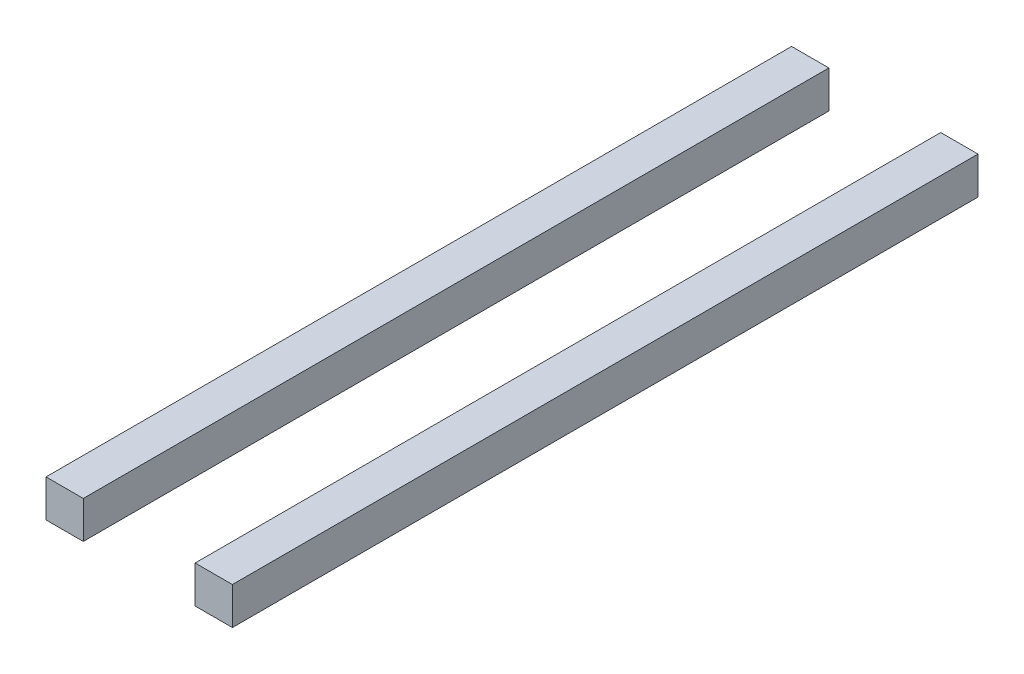
ISO-10303-21;
HEADER;
FILE_DESCRIPTION(('STEP AP214'),'2;1');
FILE_NAME('part.step','',(''),(''),'','','');
FILE_SCHEMA(('AUTOMOTIVE_DESIGN { 1 0 10303 214 1 1 1 1 }'));
ENDSEC;
DATA;
#1=APPLICATION_CONTEXT('core data for automotive mechanical design processes');
#2=APPLICATION_PROTOCOL_DEFINITION('international standard','automotive_design',2000,#1);
#3=PRODUCT_CONTEXT('',#1,'mechanical');
#4=PRODUCT('Part','Part','',(#3));
#5=PRODUCT_RELATED_PRODUCT_CATEGORY('part','',(#4));
#6=PRODUCT_DEFINITION_FORMATION('','',#4);
#7=PRODUCT_DEFINITION_CONTEXT('part definition',#1,'design');
#8=PRODUCT_DEFINITION('design','',#6,#7);
#9=PRODUCT_DEFINITION_SHAPE('','',#8);
#10=(LENGTH_UNIT() NAMED_UNIT(*) SI_UNIT(.MILLI.,.METRE.));
#11=(NAMED_UNIT(*) PLANE_ANGLE_UNIT() SI_UNIT($,.RADIAN.));
#12=(NAMED_UNIT(*) SI_UNIT($,.STERADIAN.) SOLID_ANGLE_UNIT());
#13=UNCERTAINTY_MEASURE_WITH_UNIT(LENGTH_MEASURE(1.E-05),#10,'distance_accuracy_value','');
#14=(GEOMETRIC_REPRESENTATION_CONTEXT(3) GLOBAL_UNCERTAINTY_ASSIGNED_CONTEXT((#13)) GLOBAL_UNIT_ASSIGNED_CONTEXT((#10,
#11,#12)) REPRESENTATION_CONTEXT('',''));
#15=CARTESIAN_POINT('',(0.,0.,0.));
#16=DIRECTION('',(0.,0.,1.));
#17=DIRECTION('',(1.,0.,0.));
#18=AXIS2_PLACEMENT_3D('',#15,#16,#17);
#19=CARTESIAN_POINT('',(-50.,-20.,-400.));
#20=DIRECTION('',(-1.,0.,0.));
#21=DIRECTION('',(0.,0.,1.));
#22=AXIS2_PLACEMENT_3D('',#19,#20,#21);
#23=PLANE('',#22);
#24=DIRECTION('',(0.,-1.,0.));
#25=VECTOR('',#24,1.);
#26=CARTESIAN_POINT('',(-50.,-20.,0.));
#27=LINE('',#26,#25);
#28=CARTESIAN_POINT('',(-50.,0.,0.));
#29=VERTEX_POINT('',#28);
#30=CARTESIAN_POINT('',(-50.,-20.,0.));
#31=VERTEX_POINT('',#30);
#32=EDGE_CURVE('E12',#29,#31,#27,.T.);
#33=ORIENTED_EDGE('',*,*,#32,.F.);
#34=DIRECTION('',(0.,0.,1.));
#35=VECTOR('',#34,1.);
#36=CARTESIAN_POINT('',(-50.,0.,-400.));
#37=LINE('',#36,#35);
#38=CARTESIAN_POINT('',(-50.,0.,-400.));
#39=VERTEX_POINT('',#38);
#40=EDGE_CURVE('E101',#39,#29,#37,.T.);
#41=ORIENTED_EDGE('',*,*,#40,.F.);
#42=DIRECTION('',(0.,-1.,0.));
#43=VECTOR('',#42,1.);
#44=CARTESIAN_POINT('',(-50.,-20.,-400.));
#45=LINE('',#44,#43);
#46=CARTESIAN_POINT('',(-50.,-20.,-400.));
#47=VERTEX_POINT('',#46);
#48=EDGE_CURVE('E57',#39,#47,#45,.T.);
#49=ORIENTED_EDGE('',*,*,#48,.T.);
#50=DIRECTION('',(0.,0.,1.));
#51=VECTOR('',#50,1.);
#52=CARTESIAN_POINT('',(-50.,-20.,-400.));
#53=LINE('',#52,#51);
#54=EDGE_CURVE('E73',#47,#31,#53,.T.);
#55=ORIENTED_EDGE('',*,*,#54,.T.);
#56=EDGE_LOOP('',(#33,#41,#49,#55));
#57=FACE_BOUND('',#56,.T.);
#58=ADVANCED_FACE('F53',(#57),#23,.T.);
#59=CARTESIAN_POINT('',(-50.,0.,-400.));
#60=DIRECTION('',(0.,1.,0.));
#61=DIRECTION('',(0.,0.,1.));
#62=AXIS2_PLACEMENT_3D('',#59,#60,#61);
#63=PLANE('',#62);
#64=DIRECTION('',(-1.,0.,0.));
#65=VECTOR('',#64,1.);
#66=CARTESIAN_POINT('',(-50.,0.,0.));
#67=LINE('',#66,#65);
#68=CARTESIAN_POINT('',(-30.,0.,0.));
#69=VERTEX_POINT('',#68);
#70=EDGE_CURVE('E115',#69,#29,#67,.T.);
#71=ORIENTED_EDGE('',*,*,#70,.F.);
#72=DIRECTION('',(0.,0.,1.));
#73=VECTOR('',#72,1.);
#74=CARTESIAN_POINT('',(-30.,0.,-400.));
#75=LINE('',#74,#73);
#76=CARTESIAN_POINT('',(-30.,0.,-400.));
#77=VERTEX_POINT('',#76);
#78=EDGE_CURVE('E103',#77,#69,#75,.T.);
#79=ORIENTED_EDGE('',*,*,#78,.F.);
#80=DIRECTION('',(-1.,0.,0.));
#81=VECTOR('',#80,1.);
#82=CARTESIAN_POINT('',(-50.,0.,-400.));
#83=LINE('',#82,#81);
#84=EDGE_CURVE('E127',#77,#39,#83,.T.);
#85=ORIENTED_EDGE('',*,*,#84,.T.);
#86=ORIENTED_EDGE('',*,*,#40,.T.);
#87=EDGE_LOOP('',(#71,#79,#85,#86));
#88=FACE_BOUND('',#87,.T.);
#89=ADVANCED_FACE('F118',(#88),#63,.T.);
#90=CARTESIAN_POINT('',(-30.,-20.,-400.));
#91=DIRECTION('',(1.,0.,0.));
#92=DIRECTION('',(0.,0.,-1.));
#93=AXIS2_PLACEMENT_3D('',#90,#91,#92);
#94=PLANE('',#93);
#95=DIRECTION('',(0.,1.,0.));
#96=VECTOR('',#95,1.);
#97=CARTESIAN_POINT('',(-30.,-20.,0.));
#98=LINE('',#97,#96);
#99=CARTESIAN_POINT('',(-30.,-20.,0.));
#100=VERTEX_POINT('',#99);
#101=EDGE_CURVE('E106',#100,#69,#98,.T.);
#102=ORIENTED_EDGE('',*,*,#101,.F.);
#103=DIRECTION('',(0.,0.,1.));
#104=VECTOR('',#103,1.);
#105=CARTESIAN_POINT('',(-30.,-20.,-400.));
#106=LINE('',#105,#104);
#107=CARTESIAN_POINT('',(-30.,-20.,-400.));
#108=VERTEX_POINT('',#107);
#109=EDGE_CURVE('E90',#108,#100,#106,.T.);
#110=ORIENTED_EDGE('',*,*,#109,.F.);
#111=DIRECTION('',(0.,1.,0.));
#112=VECTOR('',#111,1.);
#113=CARTESIAN_POINT('',(-30.,-20.,-400.));
#114=LINE('',#113,#112);
#115=EDGE_CURVE('E108',#108,#77,#114,.T.);
#116=ORIENTED_EDGE('',*,*,#115,.T.);
#117=ORIENTED_EDGE('',*,*,#78,.T.);
#118=EDGE_LOOP('',(#102,#110,#116,#117));
#119=FACE_BOUND('',#118,.T.);
#120=ADVANCED_FACE('F105',(#119),#94,.T.);
#121=CARTESIAN_POINT('',(-50.,-20.,-400.));
#122=DIRECTION('',(0.,-1.,0.));
#123=DIRECTION('',(0.,0.,-1.));
#124=AXIS2_PLACEMENT_3D('',#121,#122,#123);
#125=PLANE('',#124);
#126=DIRECTION('',(1.,0.,0.));
#127=VECTOR('',#126,1.);
#128=CARTESIAN_POINT('',(-50.,-20.,0.));
#129=LINE('',#128,#127);
#130=EDGE_CURVE('E64',#31,#100,#129,.T.);
#131=ORIENTED_EDGE('',*,*,#130,.F.);
#132=ORIENTED_EDGE('',*,*,#54,.F.);
#133=DIRECTION('',(1.,0.,0.));
#134=VECTOR('',#133,1.);
#135=CARTESIAN_POINT('',(-50.,-20.,-400.));
#136=LINE('',#135,#134);
#137=EDGE_CURVE('E122',#47,#108,#136,.T.);
#138=ORIENTED_EDGE('',*,*,#137,.T.);
#139=ORIENTED_EDGE('',*,*,#109,.T.);
#140=EDGE_LOOP('',(#131,#132,#138,#139));
#141=FACE_BOUND('',#140,.T.);
#142=ADVANCED_FACE('F132',(#141),#125,.T.);
#143=CARTESIAN_POINT('',(0.,0.,-400.));
#144=DIRECTION('',(0.,0.,-1.));
#145=DIRECTION('',(-1.,0.,0.));
#146=AXIS2_PLACEMENT_3D('',#143,#144,#145);
#147=PLANE('',#146);
#148=ORIENTED_EDGE('',*,*,#48,.F.);
#149=ORIENTED_EDGE('',*,*,#84,.F.);
#150=ORIENTED_EDGE('',*,*,#115,.F.);
#151=ORIENTED_EDGE('',*,*,#137,.F.);
#152=EDGE_LOOP('',(#148,#149,#150,#151));
#153=FACE_BOUND('',#152,.T.);
#154=ADVANCED_FACE('F55',(#153),#147,.T.);
#155=CARTESIAN_POINT('',(0.,0.,0.));
#156=DIRECTION('',(0.,0.,-1.));
#157=DIRECTION('',(-1.,0.,0.));
#158=AXIS2_PLACEMENT_3D('',#155,#156,#157);
#159=PLANE('',#158);
#160=ORIENTED_EDGE('',*,*,#32,.T.);
#161=ORIENTED_EDGE('',*,*,#130,.T.);
#162=ORIENTED_EDGE('',*,*,#101,.T.);
#163=ORIENTED_EDGE('',*,*,#70,.T.);
#164=EDGE_LOOP('',(#160,#161,#162,#163));
#165=FACE_BOUND('',#164,.T.);
#166=ADVANCED_FACE('F114',(#165),#159,.F.);
#167=CLOSED_SHELL('',(#58,#89,#120,#142,#154,#166));
#168=MANIFOLD_SOLID_BREP('B2',#167);
#169=CARTESIAN_POINT('',(30.,-20.,-400.));
#170=DIRECTION('',(-1.,0.,0.));
#171=DIRECTION('',(0.,0.,1.));
#172=AXIS2_PLACEMENT_3D('',#169,#170,#171);
#173=PLANE('',#172);
#174=DIRECTION('',(0.,-1.,0.));
#175=VECTOR('',#174,1.);
#176=CARTESIAN_POINT('',(30.,-20.,0.));
#177=LINE('',#176,#175);
#178=CARTESIAN_POINT('',(30.,0.,0.));
#179=VERTEX_POINT('',#178);
#180=CARTESIAN_POINT('',(30.,-20.,0.));
#181=VERTEX_POINT('',#180);
#182=EDGE_CURVE('E265',#179,#181,#177,.T.);
#183=ORIENTED_EDGE('',*,*,#182,.F.);
#184=DIRECTION('',(0.,0.,1.));
#185=VECTOR('',#184,1.);
#186=CARTESIAN_POINT('',(30.,0.,-400.));
#187=LINE('',#186,#185);
#188=CARTESIAN_POINT('',(30.,0.,-400.));
#189=VERTEX_POINT('',#188);
#190=EDGE_CURVE('E51',#189,#179,#187,.T.);
#191=ORIENTED_EDGE('',*,*,#190,.F.);
#192=DIRECTION('',(0.,-1.,0.));
#193=VECTOR('',#192,1.);
#194=CARTESIAN_POINT('',(30.,-20.,-400.));
#195=LINE('',#194,#193);
#196=CARTESIAN_POINT('',(30.,-20.,-400.));
#197=VERTEX_POINT('',#196);
#198=EDGE_CURVE('E259',#189,#197,#195,.T.);
#199=ORIENTED_EDGE('',*,*,#198,.T.);
#200=DIRECTION('',(0.,0.,1.));
#201=VECTOR('',#200,1.);
#202=CARTESIAN_POINT('',(30.,-20.,-400.));
#203=LINE('',#202,#201);
#204=EDGE_CURVE('E204',#197,#181,#203,.T.);
#205=ORIENTED_EDGE('',*,*,#204,.T.);
#206=EDGE_LOOP('',(#183,#191,#199,#205));
#207=FACE_BOUND('',#206,.T.);
#208=ADVANCED_FACE('F201',(#207),#173,.T.);
#209=CARTESIAN_POINT('',(30.,0.,-400.));
#210=DIRECTION('',(0.,1.,0.));
#211=DIRECTION('',(0.,0.,1.));
#212=AXIS2_PLACEMENT_3D('',#209,#210,#211);
#213=PLANE('',#212);
#214=DIRECTION('',(-1.,0.,0.));
#215=VECTOR('',#214,1.);
#216=CARTESIAN_POINT('',(30.,0.,0.));
#217=LINE('',#216,#215);
#218=CARTESIAN_POINT('',(50.,0.,0.));
#219=VERTEX_POINT('',#218);
#220=EDGE_CURVE('E261',#219,#179,#217,.T.);
#221=ORIENTED_EDGE('',*,*,#220,.F.);
#222=DIRECTION('',(0.,0.,1.));
#223=VECTOR('',#222,1.);
#224=CARTESIAN_POINT('',(50.,0.,-400.));
#225=LINE('',#224,#223);
#226=CARTESIAN_POINT('',(50.,0.,-400.));
#227=VERTEX_POINT('',#226);
#228=EDGE_CURVE('E210',#227,#219,#225,.T.);
#229=ORIENTED_EDGE('',*,*,#228,.F.);
#230=DIRECTION('',(-1.,0.,0.));
#231=VECTOR('',#230,1.);
#232=CARTESIAN_POINT('',(30.,0.,-400.));
#233=LINE('',#232,#231);
#234=EDGE_CURVE('E256',#227,#189,#233,.T.);
#235=ORIENTED_EDGE('',*,*,#234,.T.);
#236=ORIENTED_EDGE('',*,*,#190,.T.);
#237=EDGE_LOOP('',(#221,#229,#235,#236));
#238=FACE_BOUND('',#237,.T.);
#239=ADVANCED_FACE('F275',(#238),#213,.T.);
#240=CARTESIAN_POINT('',(50.,-20.,-400.));
#241=DIRECTION('',(1.,0.,0.));
#242=DIRECTION('',(0.,0.,-1.));
#243=AXIS2_PLACEMENT_3D('',#240,#241,#242);
#244=PLANE('',#243);
#245=DIRECTION('',(0.,1.,0.));
#246=VECTOR('',#245,1.);
#247=CARTESIAN_POINT('',(50.,-20.,0.));
#248=LINE('',#247,#246);
#249=CARTESIAN_POINT('',(50.,-20.,0.));
#250=VERTEX_POINT('',#249);
#251=EDGE_CURVE('E251',#250,#219,#248,.T.);
#252=ORIENTED_EDGE('',*,*,#251,.F.);
#253=DIRECTION('',(0.,0.,1.));
#254=VECTOR('',#253,1.);
#255=CARTESIAN_POINT('',(50.,-20.,-400.));
#256=LINE('',#255,#254);
#257=CARTESIAN_POINT('',(50.,-20.,-400.));
#258=VERTEX_POINT('',#257);
#259=EDGE_CURVE('E246',#258,#250,#256,.T.);
#260=ORIENTED_EDGE('',*,*,#259,.F.);
#261=DIRECTION('',(0.,1.,0.));
#262=VECTOR('',#261,1.);
#263=CARTESIAN_POINT('',(50.,-20.,-400.));
#264=LINE('',#263,#262);
#265=EDGE_CURVE('E249',#258,#227,#264,.T.);
#266=ORIENTED_EDGE('',*,*,#265,.T.);
#267=ORIENTED_EDGE('',*,*,#228,.T.);
#268=EDGE_LOOP('',(#252,#260,#266,#267));
#269=FACE_BOUND('',#268,.T.);
#270=ADVANCED_FACE('F248',(#269),#244,.T.);
#271=CARTESIAN_POINT('',(30.,-20.,-400.));
#272=DIRECTION('',(0.,-1.,0.));
#273=DIRECTION('',(0.,0.,-1.));
#274=AXIS2_PLACEMENT_3D('',#271,#272,#273);
#275=PLANE('',#274);
#276=DIRECTION('',(1.,0.,0.));
#277=VECTOR('',#276,1.);
#278=CARTESIAN_POINT('',(30.,-20.,0.));
#279=LINE('',#278,#277);
#280=EDGE_CURVE('E268',#181,#250,#279,.T.);
#281=ORIENTED_EDGE('',*,*,#280,.F.);
#282=ORIENTED_EDGE('',*,*,#204,.F.);
#283=DIRECTION('',(1.,0.,0.));
#284=VECTOR('',#283,1.);
#285=CARTESIAN_POINT('',(30.,-20.,-400.));
#286=LINE('',#285,#284);
#287=EDGE_CURVE('E255',#197,#258,#286,.T.);
#288=ORIENTED_EDGE('',*,*,#287,.T.);
#289=ORIENTED_EDGE('',*,*,#259,.T.);
#290=EDGE_LOOP('',(#281,#282,#288,#289));
#291=FACE_BOUND('',#290,.T.);
#292=ADVANCED_FACE('F258',(#291),#275,.T.);
#293=CARTESIAN_POINT('',(0.,0.,-400.));
#294=DIRECTION('',(0.,0.,-1.));
#295=DIRECTION('',(-1.,0.,0.));
#296=AXIS2_PLACEMENT_3D('',#293,#294,#295);
#297=PLANE('',#296);
#298=ORIENTED_EDGE('',*,*,#198,.F.);
#299=ORIENTED_EDGE('',*,*,#234,.F.);
#300=ORIENTED_EDGE('',*,*,#265,.F.);
#301=ORIENTED_EDGE('',*,*,#287,.F.);
#302=EDGE_LOOP('',(#298,#299,#300,#301));
#303=FACE_BOUND('',#302,.T.);
#304=ADVANCED_FACE('F254',(#303),#297,.T.);
#305=CARTESIAN_POINT('',(0.,0.,0.));
#306=DIRECTION('',(0.,0.,-1.));
#307=DIRECTION('',(-1.,0.,0.));
#308=AXIS2_PLACEMENT_3D('',#305,#306,#307);
#309=PLANE('',#308);
#310=ORIENTED_EDGE('',*,*,#182,.T.);
#311=ORIENTED_EDGE('',*,*,#280,.T.);
#312=ORIENTED_EDGE('',*,*,#251,.T.);
#313=ORIENTED_EDGE('',*,*,#220,.T.);
#314=EDGE_LOOP('',(#310,#311,#312,#313));
#315=FACE_BOUND('',#314,.T.);
#316=ADVANCED_FACE('F274',(#315),#309,.F.);
#317=CLOSED_SHELL('',(#208,#239,#270,#292,#304,#316));
#318=MANIFOLD_SOLID_BREP('B6',#317);
#319=ADVANCED_BREP_SHAPE_REPRESENTATION('',(#18,#168,#318),#14);
#320=SHAPE_DEFINITION_REPRESENTATION(#9,#319);
ENDSEC;
END-ISO-10303-21;
